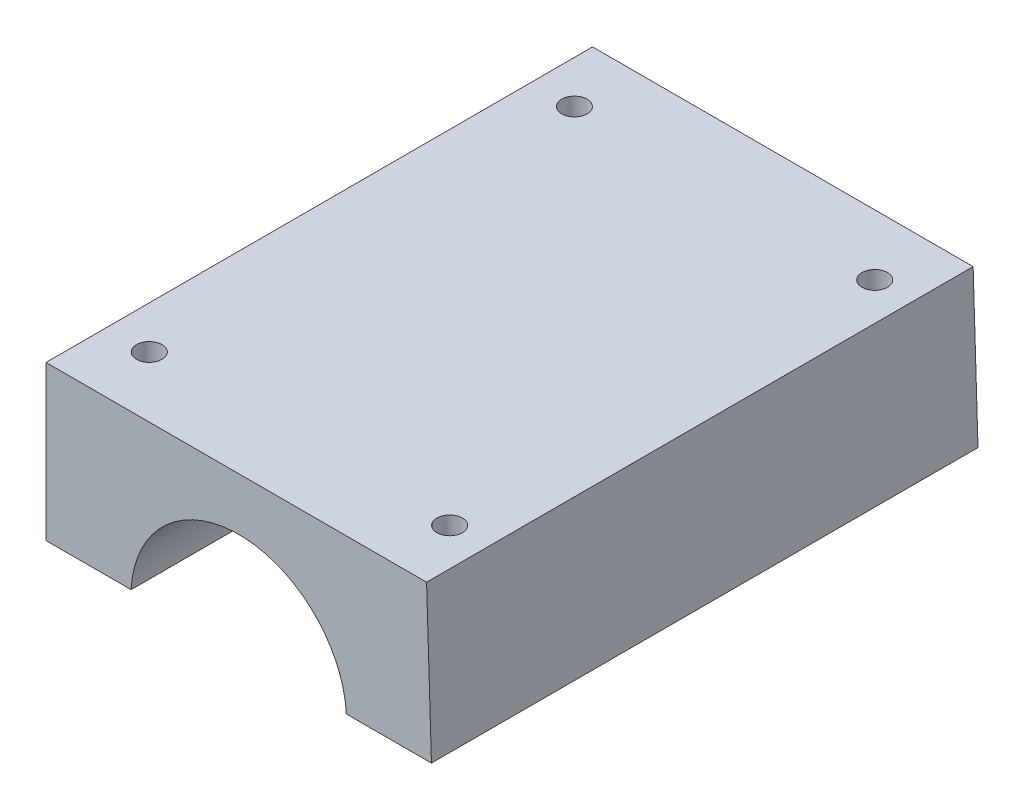
ISO-10303-21;
HEADER;
FILE_DESCRIPTION(('STEP AP214'),'2;1');
FILE_NAME('part.step','',(''),(''),'','','');
FILE_SCHEMA(('AUTOMOTIVE_DESIGN { 1 0 10303 214 1 1 1 1 }'));
ENDSEC;
DATA;
#1=APPLICATION_CONTEXT('core data for automotive mechanical design processes');
#2=APPLICATION_PROTOCOL_DEFINITION('international standard','automotive_design',2000,#1);
#3=PRODUCT_CONTEXT('',#1,'mechanical');
#4=PRODUCT('Part','Part','',(#3));
#5=PRODUCT_RELATED_PRODUCT_CATEGORY('part','',(#4));
#6=PRODUCT_DEFINITION_FORMATION('','',#4);
#7=PRODUCT_DEFINITION_CONTEXT('part definition',#1,'design');
#8=PRODUCT_DEFINITION('design','',#6,#7);
#9=PRODUCT_DEFINITION_SHAPE('','',#8);
#10=(LENGTH_UNIT() NAMED_UNIT(*) SI_UNIT(.MILLI.,.METRE.));
#11=(NAMED_UNIT(*) PLANE_ANGLE_UNIT() SI_UNIT($,.RADIAN.));
#12=(NAMED_UNIT(*) SI_UNIT($,.STERADIAN.) SOLID_ANGLE_UNIT());
#13=UNCERTAINTY_MEASURE_WITH_UNIT(LENGTH_MEASURE(1.E-05),#10,'distance_accuracy_value','');
#14=(GEOMETRIC_REPRESENTATION_CONTEXT(3) GLOBAL_UNCERTAINTY_ASSIGNED_CONTEXT((#13)) GLOBAL_UNIT_ASSIGNED_CONTEXT((#10,
#11,#12)) REPRESENTATION_CONTEXT('',''));
#15=CARTESIAN_POINT('',(0.,0.,0.));
#16=DIRECTION('',(0.,0.,1.));
#17=DIRECTION('',(1.,0.,0.));
#18=AXIS2_PLACEMENT_3D('',#15,#16,#17);
#19=CARTESIAN_POINT('',(-31.734248061046,1.,90.));
#20=DIRECTION('',(0.,1.,0.));
#21=DIRECTION('',(0.,0.,1.));
#22=AXIS2_PLACEMENT_3D('',#19,#20,#21);
#23=PLANE('',#22);
#24=DIRECTION('',(1.,0.,0.));
#25=VECTOR('',#24,1.);
#26=CARTESIAN_POINT('',(-31.734248061046,1.,0.));
#27=LINE('',#26,#25);
#28=CARTESIAN_POINT('',(-31.734248061046,1.,0.));
#29=VERTEX_POINT('',#28);
#30=CARTESIAN_POINT('',(-17.7218085984473,0.999999999999997,0.));
#31=VERTEX_POINT('',#30);
#32=EDGE_CURVE('E138',#29,#31,#27,.T.);
#33=ORIENTED_EDGE('',*,*,#32,.T.);
#34=DIRECTION('',(0.,0.,-1.));
#35=VECTOR('',#34,1.);
#36=CARTESIAN_POINT('',(-17.7218085984473,0.999999999999997,90.));
#37=LINE('',#36,#35);
#38=CARTESIAN_POINT('',(-17.7218085984473,0.999999999999997,90.));
#39=VERTEX_POINT('',#38);
#40=EDGE_CURVE('E68',#39,#31,#37,.T.);
#41=ORIENTED_EDGE('',*,*,#40,.F.);
#42=DIRECTION('',(1.,0.,0.));
#43=VECTOR('',#42,1.);
#44=CARTESIAN_POINT('',(-31.734248061046,1.,90.));
#45=LINE('',#44,#43);
#46=CARTESIAN_POINT('',(-31.734248061046,1.,90.));
#47=VERTEX_POINT('',#46);
#48=EDGE_CURVE('E112',#47,#39,#45,.T.);
#49=ORIENTED_EDGE('',*,*,#48,.F.);
#50=DIRECTION('',(0.,0.,-1.));
#51=VECTOR('',#50,1.);
#52=CARTESIAN_POINT('',(-31.734248061046,1.,90.));
#53=LINE('',#52,#51);
#54=EDGE_CURVE('E12',#47,#29,#53,.T.);
#55=ORIENTED_EDGE('',*,*,#54,.T.);
#56=EDGE_LOOP('',(#33,#41,#49,#55));
#57=FACE_BOUND('',#56,.T.);
#58=CARTESIAN_POINT('',(-24.7280283297466,1.,10.));
#59=DIRECTION('',(0.,-1.,0.));
#60=DIRECTION('',(0.,0.,-1.));
#61=AXIS2_PLACEMENT_3D('',#58,#59,#60);
#62=CIRCLE('',#61,2.1);
#63=CARTESIAN_POINT('',(-24.7280283297466,1.,7.9));
#64=VERTEX_POINT('',#63);
#65=EDGE_CURVE('E195',#64,#64,#62,.T.);
#66=ORIENTED_EDGE('',*,*,#65,.F.);
#67=EDGE_LOOP('',(#66));
#68=FACE_BOUND('',#67,.T.);
#69=CARTESIAN_POINT('',(-24.7280283297466,1.,80.));
#70=DIRECTION('',(0.,-1.,0.));
#71=DIRECTION('',(0.,0.,-1.));
#72=AXIS2_PLACEMENT_3D('',#69,#70,#71);
#73=CIRCLE('',#72,2.1);
#74=CARTESIAN_POINT('',(-24.7280283297466,1.,77.9));
#75=VERTEX_POINT('',#74);
#76=EDGE_CURVE('E198',#75,#75,#73,.T.);
#77=ORIENTED_EDGE('',*,*,#76,.F.);
#78=EDGE_LOOP('',(#77));
#79=FACE_BOUND('',#78,.T.);
#80=ADVANCED_FACE('F61',(#57,#68,#79),#23,.F.);
#81=CARTESIAN_POINT('',(0.,0.,90.));
#82=DIRECTION('',(0.,0.,-1.));
#83=DIRECTION('',(-1.,0.,0.));
#84=AXIS2_PLACEMENT_3D('',#81,#82,#83);
#85=CYLINDRICAL_SURFACE('',#84,17.75);
#86=CARTESIAN_POINT('',(0.,0.,0.));
#87=DIRECTION('',(0.,0.,-1.));
#88=DIRECTION('',(1.,0.,0.));
#89=AXIS2_PLACEMENT_3D('',#86,#87,#88);
#90=CIRCLE('',#89,17.75);
#91=CARTESIAN_POINT('',(17.7218085984473,1.,0.));
#92=VERTEX_POINT('',#91);
#93=EDGE_CURVE('E140',#31,#92,#90,.T.);
#94=ORIENTED_EDGE('',*,*,#93,.T.);
#95=DIRECTION('',(0.,0.,-1.));
#96=VECTOR('',#95,1.);
#97=CARTESIAN_POINT('',(17.7218085984473,1.,90.));
#98=LINE('',#97,#96);
#99=CARTESIAN_POINT('',(17.7218085984473,1.,90.));
#100=VERTEX_POINT('',#99);
#101=EDGE_CURVE('E155',#100,#92,#98,.T.);
#102=ORIENTED_EDGE('',*,*,#101,.F.);
#103=CARTESIAN_POINT('',(0.,0.,90.));
#104=DIRECTION('',(0.,0.,-1.));
#105=DIRECTION('',(1.,0.,0.));
#106=AXIS2_PLACEMENT_3D('',#103,#104,#105);
#107=CIRCLE('',#106,17.75);
#108=EDGE_CURVE('E147',#39,#100,#107,.T.);
#109=ORIENTED_EDGE('',*,*,#108,.F.);
#110=ORIENTED_EDGE('',*,*,#40,.T.);
#111=EDGE_LOOP('',(#94,#102,#109,#110));
#112=FACE_BOUND('',#111,.T.);
#113=ADVANCED_FACE('F161',(#112),#85,.F.);
#114=CARTESIAN_POINT('',(17.7218085984473,1.,90.));
#115=DIRECTION('',(0.,1.,0.));
#116=DIRECTION('',(0.,0.,1.));
#117=AXIS2_PLACEMENT_3D('',#114,#115,#116);
#118=PLANE('',#117);
#119=CARTESIAN_POINT('',(24.7280283297466,1.,80.));
#120=DIRECTION('',(0.,-1.,0.));
#121=DIRECTION('',(0.,0.,-1.));
#122=AXIS2_PLACEMENT_3D('',#119,#120,#121);
#123=CIRCLE('',#122,2.1);
#124=CARTESIAN_POINT('',(24.7280283297466,1.,77.9));
#125=VERTEX_POINT('',#124);
#126=EDGE_CURVE('E209',#125,#125,#123,.T.);
#127=ORIENTED_EDGE('',*,*,#126,.F.);
#128=EDGE_LOOP('',(#127));
#129=FACE_BOUND('',#128,.T.);
#130=CARTESIAN_POINT('',(24.7280283297466,1.,10.0000000000001));
#131=DIRECTION('',(0.,-1.,0.));
#132=DIRECTION('',(0.,0.,-1.));
#133=AXIS2_PLACEMENT_3D('',#130,#131,#132);
#134=CIRCLE('',#133,2.1);
#135=CARTESIAN_POINT('',(24.7280283297466,1.,7.90000000000006));
#136=VERTEX_POINT('',#135);
#137=EDGE_CURVE('E215',#136,#136,#134,.T.);
#138=ORIENTED_EDGE('',*,*,#137,.F.);
#139=EDGE_LOOP('',(#138));
#140=FACE_BOUND('',#139,.T.);
#141=DIRECTION('',(1.,0.,0.));
#142=VECTOR('',#141,1.);
#143=CARTESIAN_POINT('',(17.7218085984473,1.,0.));
#144=LINE('',#143,#142);
#145=CARTESIAN_POINT('',(31.734248061046,1.,0.));
#146=VERTEX_POINT('',#145);
#147=EDGE_CURVE('E105',#92,#146,#144,.T.);
#148=ORIENTED_EDGE('',*,*,#147,.T.);
#149=DIRECTION('',(0.,0.,-1.));
#150=VECTOR('',#149,1.);
#151=CARTESIAN_POINT('',(31.734248061046,1.,90.));
#152=LINE('',#151,#150);
#153=CARTESIAN_POINT('',(31.734248061046,1.,90.));
#154=VERTEX_POINT('',#153);
#155=EDGE_CURVE('E150',#154,#146,#152,.T.);
#156=ORIENTED_EDGE('',*,*,#155,.F.);
#157=DIRECTION('',(1.,0.,0.));
#158=VECTOR('',#157,1.);
#159=CARTESIAN_POINT('',(17.7218085984473,1.,90.));
#160=LINE('',#159,#158);
#161=EDGE_CURVE('E84',#100,#154,#160,.T.);
#162=ORIENTED_EDGE('',*,*,#161,.F.);
#163=ORIENTED_EDGE('',*,*,#101,.T.);
#164=EDGE_LOOP('',(#148,#156,#162,#163));
#165=FACE_BOUND('',#164,.T.);
#166=ADVANCED_FACE('F174',(#129,#140,#165),#118,.F.);
#167=CARTESIAN_POINT('',(0.,0.,90.));
#168=DIRECTION('',(0.,0.,1.));
#169=DIRECTION('',(1.,0.,0.));
#170=AXIS2_PLACEMENT_3D('',#167,#168,#169);
#171=PLANE('',#170);
#172=DIRECTION('',(1.,0.,0.));
#173=VECTOR('',#172,1.);
#174=CARTESIAN_POINT('',(-31.734248061046,26.4,90.));
#175=LINE('',#174,#173);
#176=CARTESIAN_POINT('',(-31.734248061046,26.4,90.));
#177=VERTEX_POINT('',#176);
#178=CARTESIAN_POINT('',(30.9338509647877,26.4,90.));
#179=VERTEX_POINT('',#178);
#180=EDGE_CURVE('E121',#177,#179,#175,.T.);
#181=ORIENTED_EDGE('',*,*,#180,.F.);
#182=DIRECTION('',(0.,1.,0.));
#183=VECTOR('',#182,1.);
#184=CARTESIAN_POINT('',(-31.734248061046,0.,90.));
#185=LINE('',#184,#183);
#186=EDGE_CURVE('E142',#47,#177,#185,.T.);
#187=ORIENTED_EDGE('',*,*,#186,.F.);
#188=ORIENTED_EDGE('',*,*,#48,.T.);
#189=ORIENTED_EDGE('',*,*,#108,.T.);
#190=ORIENTED_EDGE('',*,*,#161,.T.);
#191=DIRECTION('',(-0.031496062992126,0.999503875938456,0.));
#192=VECTOR('',#191,1.);
#193=CARTESIAN_POINT('',(31.734248061046,1.,90.));
#194=LINE('',#193,#192);
#195=EDGE_CURVE('E132',#154,#179,#194,.T.);
#196=ORIENTED_EDGE('',*,*,#195,.T.);
#197=EDGE_LOOP('',(#181,#187,#188,#189,#190,#196));
#198=FACE_BOUND('',#197,.T.);
#199=ADVANCED_FACE('F137',(#198),#171,.T.);
#200=CARTESIAN_POINT('',(0.,0.,0.));
#201=DIRECTION('',(0.,0.,1.));
#202=DIRECTION('',(1.,0.,0.));
#203=AXIS2_PLACEMENT_3D('',#200,#201,#202);
#204=PLANE('',#203);
#205=DIRECTION('',(0.,1.,0.));
#206=VECTOR('',#205,1.);
#207=CARTESIAN_POINT('',(-31.734248061046,0.,0.));
#208=LINE('',#207,#206);
#209=CARTESIAN_POINT('',(-31.734248061046,26.4,0.));
#210=VERTEX_POINT('',#209);
#211=EDGE_CURVE('E167',#29,#210,#208,.T.);
#212=ORIENTED_EDGE('',*,*,#211,.T.);
#213=DIRECTION('',(-1.,0.,0.));
#214=VECTOR('',#213,1.);
#215=CARTESIAN_POINT('',(-31.734248061046,26.4,0.));
#216=LINE('',#215,#214);
#217=CARTESIAN_POINT('',(30.9338509647877,26.4,0.));
#218=VERTEX_POINT('',#217);
#219=EDGE_CURVE('E75',#218,#210,#216,.T.);
#220=ORIENTED_EDGE('',*,*,#219,.F.);
#221=DIRECTION('',(-0.031496062992126,0.999503875938456,0.));
#222=VECTOR('',#221,1.);
#223=CARTESIAN_POINT('',(31.734248061046,1.,0.));
#224=LINE('',#223,#222);
#225=EDGE_CURVE('E134',#146,#218,#224,.T.);
#226=ORIENTED_EDGE('',*,*,#225,.F.);
#227=ORIENTED_EDGE('',*,*,#147,.F.);
#228=ORIENTED_EDGE('',*,*,#93,.F.);
#229=ORIENTED_EDGE('',*,*,#32,.F.);
#230=EDGE_LOOP('',(#212,#220,#226,#227,#228,#229));
#231=FACE_BOUND('',#230,.T.);
#232=ADVANCED_FACE('F165',(#231),#204,.F.);
#233=CARTESIAN_POINT('',(31.734248061046,1.,134.188516607825));
#234=DIRECTION('',(-0.999503875938456,-0.031496062992126,0.));
#235=DIRECTION('',(0.031496062992126,-0.999503875938456,0.));
#236=AXIS2_PLACEMENT_3D('',#233,#234,#235);
#237=PLANE('',#236);
#238=ORIENTED_EDGE('',*,*,#225,.T.);
#239=DIRECTION('',(0.,0.,-1.));
#240=VECTOR('',#239,1.);
#241=CARTESIAN_POINT('',(30.9338509647877,26.4,-0.001000000000001));
#242=LINE('',#241,#240);
#243=EDGE_CURVE('E124',#179,#218,#242,.T.);
#244=ORIENTED_EDGE('',*,*,#243,.F.);
#245=ORIENTED_EDGE('',*,*,#195,.F.);
#246=ORIENTED_EDGE('',*,*,#155,.T.);
#247=EDGE_LOOP('',(#238,#244,#245,#246));
#248=FACE_BOUND('',#247,.T.);
#249=ADVANCED_FACE('F131',(#248),#237,.F.);
#250=CARTESIAN_POINT('',(-31.734248061046,0.,134.188516607825));
#251=DIRECTION('',(-1.,0.,0.));
#252=DIRECTION('',(0.,0.,1.));
#253=AXIS2_PLACEMENT_3D('',#250,#251,#252);
#254=PLANE('',#253);
#255=DIRECTION('',(0.,0.,1.));
#256=VECTOR('',#255,1.);
#257=CARTESIAN_POINT('',(-31.734248061046,26.4,-0.001000000000001));
#258=LINE('',#257,#256);
#259=EDGE_CURVE('E125',#210,#177,#258,.T.);
#260=ORIENTED_EDGE('',*,*,#259,.F.);
#261=ORIENTED_EDGE('',*,*,#211,.F.);
#262=ORIENTED_EDGE('',*,*,#54,.F.);
#263=ORIENTED_EDGE('',*,*,#186,.T.);
#264=EDGE_LOOP('',(#260,#261,#262,#263));
#265=FACE_BOUND('',#264,.T.);
#266=ADVANCED_FACE('F173',(#265),#254,.T.);
#267=CARTESIAN_POINT('',(-31.734248061046,26.4,-0.001000000000001));
#268=DIRECTION('',(0.,-1.,0.));
#269=DIRECTION('',(0.,0.,-1.));
#270=AXIS2_PLACEMENT_3D('',#267,#268,#269);
#271=PLANE('',#270);
#272=CARTESIAN_POINT('',(-24.7280283297466,26.4,80.));
#273=DIRECTION('',(0.,-1.,0.));
#274=DIRECTION('',(0.,0.,-1.));
#275=AXIS2_PLACEMENT_3D('',#272,#273,#274);
#276=CIRCLE('',#275,2.1);
#277=CARTESIAN_POINT('',(-24.7280283297466,26.4,77.9));
#278=VERTEX_POINT('',#277);
#279=EDGE_CURVE('E200',#278,#278,#276,.T.);
#280=ORIENTED_EDGE('',*,*,#279,.T.);
#281=EDGE_LOOP('',(#280));
#282=FACE_BOUND('',#281,.T.);
#283=CARTESIAN_POINT('',(-24.7280283297466,26.4,10.));
#284=DIRECTION('',(0.,-1.,0.));
#285=DIRECTION('',(0.,0.,-1.));
#286=AXIS2_PLACEMENT_3D('',#283,#284,#285);
#287=CIRCLE('',#286,2.1);
#288=CARTESIAN_POINT('',(-24.7280283297466,26.4,7.90000000000001));
#289=VERTEX_POINT('',#288);
#290=EDGE_CURVE('E206',#289,#289,#287,.T.);
#291=ORIENTED_EDGE('',*,*,#290,.T.);
#292=EDGE_LOOP('',(#291));
#293=FACE_BOUND('',#292,.T.);
#294=CARTESIAN_POINT('',(24.7280283297466,26.4,80.));
#295=DIRECTION('',(0.,-1.,0.));
#296=DIRECTION('',(0.,0.,-1.));
#297=AXIS2_PLACEMENT_3D('',#294,#295,#296);
#298=CIRCLE('',#297,2.1);
#299=CARTESIAN_POINT('',(24.7280283297466,26.4,77.9));
#300=VERTEX_POINT('',#299);
#301=EDGE_CURVE('E212',#300,#300,#298,.T.);
#302=ORIENTED_EDGE('',*,*,#301,.T.);
#303=EDGE_LOOP('',(#302));
#304=FACE_BOUND('',#303,.T.);
#305=CARTESIAN_POINT('',(24.7280283297466,26.4,10.0000000000001));
#306=DIRECTION('',(0.,-1.,0.));
#307=DIRECTION('',(0.,0.,-1.));
#308=AXIS2_PLACEMENT_3D('',#305,#306,#307);
#309=CIRCLE('',#308,2.1);
#310=CARTESIAN_POINT('',(24.7280283297466,26.4,7.90000000000006));
#311=VERTEX_POINT('',#310);
#312=EDGE_CURVE('E135',#311,#311,#309,.T.);
#313=ORIENTED_EDGE('',*,*,#312,.T.);
#314=EDGE_LOOP('',(#313));
#315=FACE_BOUND('',#314,.T.);
#316=ORIENTED_EDGE('',*,*,#219,.T.);
#317=ORIENTED_EDGE('',*,*,#259,.T.);
#318=ORIENTED_EDGE('',*,*,#180,.T.);
#319=ORIENTED_EDGE('',*,*,#243,.T.);
#320=EDGE_LOOP('',(#316,#317,#318,#319));
#321=FACE_BOUND('',#320,.T.);
#322=ADVANCED_FACE('F123',(#282,#293,#304,#315,#321),#271,.F.);
#323=CARTESIAN_POINT('',(24.7280283297466,1.,10.0000000000001));
#324=DIRECTION('',(0.,-1.,0.));
#325=DIRECTION('',(0.,0.,-1.));
#326=AXIS2_PLACEMENT_3D('',#323,#324,#325);
#327=CYLINDRICAL_SURFACE('',#326,2.1);
#328=ORIENTED_EDGE('',*,*,#312,.F.);
#329=EDGE_LOOP('',(#328));
#330=FACE_BOUND('',#329,.T.);
#331=ORIENTED_EDGE('',*,*,#137,.T.);
#332=EDGE_LOOP('',(#331));
#333=FACE_BOUND('',#332,.T.);
#334=ADVANCED_FACE('F222',(#330,#333),#327,.F.);
#335=CARTESIAN_POINT('',(24.7280283297466,1.,80.));
#336=DIRECTION('',(0.,-1.,0.));
#337=DIRECTION('',(0.,0.,-1.));
#338=AXIS2_PLACEMENT_3D('',#335,#336,#337);
#339=CYLINDRICAL_SURFACE('',#338,2.1);
#340=ORIENTED_EDGE('',*,*,#301,.F.);
#341=EDGE_LOOP('',(#340));
#342=FACE_BOUND('',#341,.T.);
#343=ORIENTED_EDGE('',*,*,#126,.T.);
#344=EDGE_LOOP('',(#343));
#345=FACE_BOUND('',#344,.T.);
#346=ADVANCED_FACE('F225',(#342,#345),#339,.F.);
#347=CARTESIAN_POINT('',(-24.7280283297466,1.,10.));
#348=DIRECTION('',(0.,-1.,0.));
#349=DIRECTION('',(0.,0.,-1.));
#350=AXIS2_PLACEMENT_3D('',#347,#348,#349);
#351=CYLINDRICAL_SURFACE('',#350,2.1);
#352=ORIENTED_EDGE('',*,*,#290,.F.);
#353=EDGE_LOOP('',(#352));
#354=FACE_BOUND('',#353,.T.);
#355=ORIENTED_EDGE('',*,*,#65,.T.);
#356=EDGE_LOOP('',(#355));
#357=FACE_BOUND('',#356,.T.);
#358=ADVANCED_FACE('F232',(#354,#357),#351,.F.);
#359=CARTESIAN_POINT('',(-24.7280283297466,1.,80.));
#360=DIRECTION('',(0.,-1.,0.));
#361=DIRECTION('',(0.,0.,-1.));
#362=AXIS2_PLACEMENT_3D('',#359,#360,#361);
#363=CYLINDRICAL_SURFACE('',#362,2.1);
#364=ORIENTED_EDGE('',*,*,#279,.F.);
#365=EDGE_LOOP('',(#364));
#366=FACE_BOUND('',#365,.T.);
#367=ORIENTED_EDGE('',*,*,#76,.T.);
#368=EDGE_LOOP('',(#367));
#369=FACE_BOUND('',#368,.T.);
#370=ADVANCED_FACE('F291',(#366,#369),#363,.F.);
#371=CLOSED_SHELL('',(#80,#113,#166,#199,#232,#249,#266,#322,#334,#346,#358,#370));
#372=MANIFOLD_SOLID_BREP('B2',#371);
#373=ADVANCED_BREP_SHAPE_REPRESENTATION('',(#18,#372),#14);
#374=SHAPE_DEFINITION_REPRESENTATION(#9,#373);
ENDSEC;
END-ISO-10303-21;
